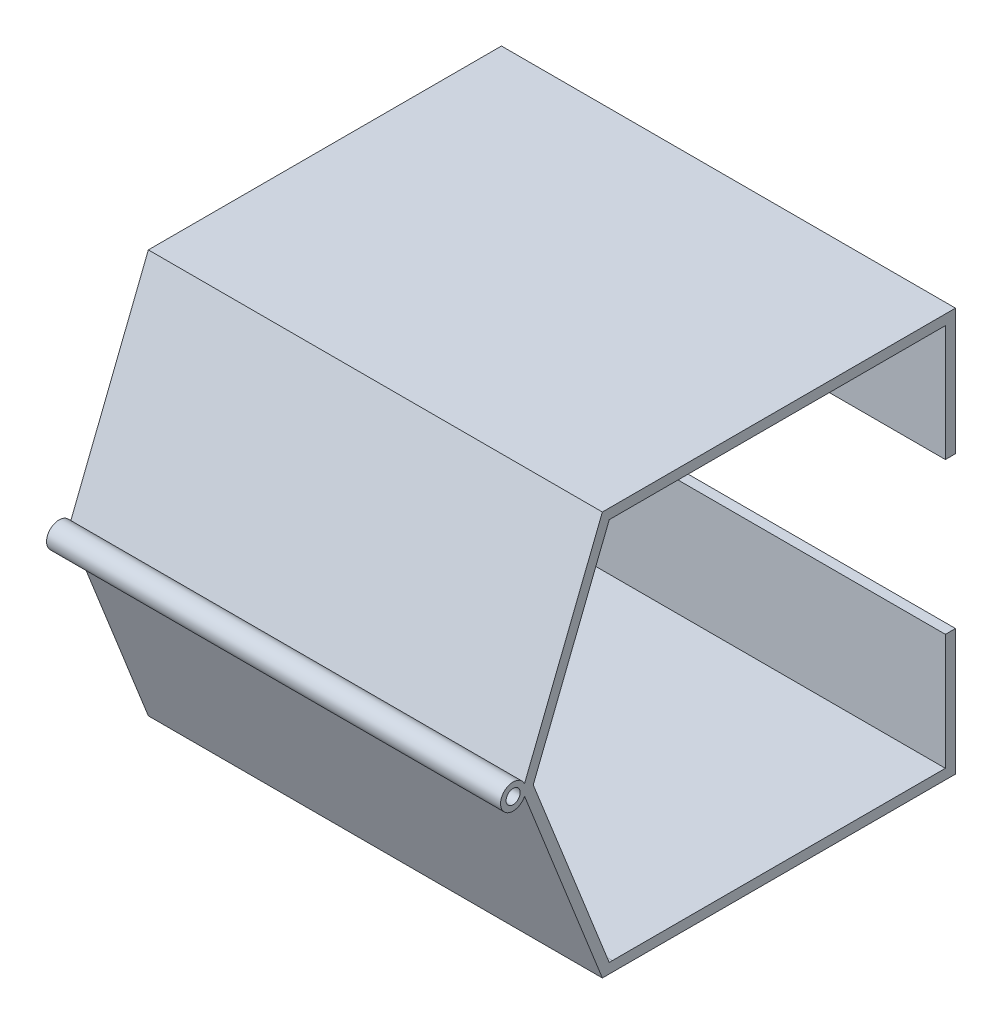
ISO-10303-21;
HEADER;
FILE_DESCRIPTION(('STEP AP214'),'2;1');
FILE_NAME('part.step','',(''),(''),'','','');
FILE_SCHEMA(('AUTOMOTIVE_DESIGN { 1 0 10303 214 1 1 1 1 }'));
ENDSEC;
DATA;
#1=APPLICATION_CONTEXT('core data for automotive mechanical design processes');
#2=APPLICATION_PROTOCOL_DEFINITION('international standard','automotive_design',2000,#1);
#3=PRODUCT_CONTEXT('',#1,'mechanical');
#4=PRODUCT('Part','Part','',(#3));
#5=PRODUCT_RELATED_PRODUCT_CATEGORY('part','',(#4));
#6=PRODUCT_DEFINITION_FORMATION('','',#4);
#7=PRODUCT_DEFINITION_CONTEXT('part definition',#1,'design');
#8=PRODUCT_DEFINITION('design','',#6,#7);
#9=PRODUCT_DEFINITION_SHAPE('','',#8);
#10=(LENGTH_UNIT() NAMED_UNIT(*) SI_UNIT(.MILLI.,.METRE.));
#11=(NAMED_UNIT(*) PLANE_ANGLE_UNIT() SI_UNIT($,.RADIAN.));
#12=(NAMED_UNIT(*) SI_UNIT($,.STERADIAN.) SOLID_ANGLE_UNIT());
#13=UNCERTAINTY_MEASURE_WITH_UNIT(LENGTH_MEASURE(1.E-05),#10,'distance_accuracy_value','');
#14=(GEOMETRIC_REPRESENTATION_CONTEXT(3) GLOBAL_UNCERTAINTY_ASSIGNED_CONTEXT((#13)) GLOBAL_UNIT_ASSIGNED_CONTEXT((#10,
#11,#12)) REPRESENTATION_CONTEXT('',''));
#15=CARTESIAN_POINT('',(0.,0.,0.));
#16=DIRECTION('',(0.,0.,1.));
#17=DIRECTION('',(1.,0.,0.));
#18=AXIS2_PLACEMENT_3D('',#15,#16,#17);
#19=CARTESIAN_POINT('',(0.,0.,0.));
#20=DIRECTION('',(0.,0.,1.));
#21=DIRECTION('',(1.,0.,0.));
#22=AXIS2_PLACEMENT_3D('',#19,#20,#21);
#23=PLANE('',#22);
#24=DIRECTION('',(0.,-1.,0.));
#25=VECTOR('',#24,1.);
#26=CARTESIAN_POINT('',(-45.,40.,0.));
#27=LINE('',#26,#25);
#28=CARTESIAN_POINT('',(-45.,-15.,0.));
#29=VERTEX_POINT('',#28);
#30=CARTESIAN_POINT('',(-45.,-40.,0.));
#31=VERTEX_POINT('',#30);
#32=EDGE_CURVE('E163',#29,#31,#27,.T.);
#33=ORIENTED_EDGE('',*,*,#32,.F.);
#34=DIRECTION('',(-1.,0.,0.));
#35=VECTOR('',#34,1.);
#36=CARTESIAN_POINT('',(-45.,-15.,0.));
#37=LINE('',#36,#35);
#38=CARTESIAN_POINT('',(45.,-15.,0.));
#39=VERTEX_POINT('',#38);
#40=EDGE_CURVE('E150',#39,#29,#37,.T.);
#41=ORIENTED_EDGE('',*,*,#40,.F.);
#42=DIRECTION('',(0.,-1.,0.));
#43=VECTOR('',#42,1.);
#44=CARTESIAN_POINT('',(45.,40.,0.));
#45=LINE('',#44,#43);
#46=CARTESIAN_POINT('',(45.,-40.,0.));
#47=VERTEX_POINT('',#46);
#48=EDGE_CURVE('E183',#39,#47,#45,.T.);
#49=ORIENTED_EDGE('',*,*,#48,.T.);
#50=DIRECTION('',(1.,0.,0.));
#51=VECTOR('',#50,1.);
#52=CARTESIAN_POINT('',(-45.,-40.,0.));
#53=LINE('',#52,#51);
#54=EDGE_CURVE('E170',#31,#47,#53,.T.);
#55=ORIENTED_EDGE('',*,*,#54,.F.);
#56=EDGE_LOOP('',(#33,#41,#49,#55));
#57=FACE_BOUND('',#56,.T.);
#58=ADVANCED_FACE('F34',(#57),#23,.F.);
#59=CARTESIAN_POINT('',(45.0000000000001,38.,2.));
#60=DIRECTION('',(0.,0.,-1.));
#61=DIRECTION('',(0.,1.,0.));
#62=AXIS2_PLACEMENT_3D('',#59,#60,#61);
#63=PLANE('',#62);
#64=DIRECTION('',(0.,-1.,0.));
#65=VECTOR('',#64,1.);
#66=CARTESIAN_POINT('',(45.0000000000001,38.,2.));
#67=LINE('',#66,#65);
#68=CARTESIAN_POINT('',(45.,-15.,2.00000000000001));
#69=VERTEX_POINT('',#68);
#70=CARTESIAN_POINT('',(45.0000000000001,-38.,2.00000000000001));
#71=VERTEX_POINT('',#70);
#72=EDGE_CURVE('E220',#69,#71,#67,.T.);
#73=ORIENTED_EDGE('',*,*,#72,.F.);
#74=DIRECTION('',(-1.,0.,0.));
#75=VECTOR('',#74,1.);
#76=CARTESIAN_POINT('',(45.0000000000001,-15.,2.00000000000001));
#77=LINE('',#76,#75);
#78=CARTESIAN_POINT('',(-45.,-15.,2.00000000000001));
#79=VERTEX_POINT('',#78);
#80=EDGE_CURVE('E11',#69,#79,#77,.T.);
#81=ORIENTED_EDGE('',*,*,#80,.T.);
#82=DIRECTION('',(0.,-1.,0.));
#83=VECTOR('',#82,1.);
#84=CARTESIAN_POINT('',(-45.,38.,2.));
#85=LINE('',#84,#83);
#86=CARTESIAN_POINT('',(-45.,-38.,2.00000000000001));
#87=VERTEX_POINT('',#86);
#88=EDGE_CURVE('E166',#79,#87,#85,.T.);
#89=ORIENTED_EDGE('',*,*,#88,.T.);
#90=DIRECTION('',(-1.,0.,0.));
#91=VECTOR('',#90,1.);
#92=CARTESIAN_POINT('',(45.0000000000001,-38.,2.00000000000001));
#93=LINE('',#92,#91);
#94=EDGE_CURVE('E239',#71,#87,#93,.T.);
#95=ORIENTED_EDGE('',*,*,#94,.F.);
#96=EDGE_LOOP('',(#73,#81,#89,#95));
#97=FACE_BOUND('',#96,.T.);
#98=ADVANCED_FACE('F342',(#97),#63,.F.);
#99=CARTESIAN_POINT('',(-45.,40.,70.));
#100=DIRECTION('',(1.,0.,0.));
#101=DIRECTION('',(0.,1.,0.));
#102=AXIS2_PLACEMENT_3D('',#99,#100,#101);
#103=PLANE('',#102);
#104=ORIENTED_EDGE('',*,*,#88,.F.);
#105=DIRECTION('',(0.,0.,-1.));
#106=VECTOR('',#105,1.);
#107=CARTESIAN_POINT('',(-45.,-15.,10.));
#108=LINE('',#107,#106);
#109=EDGE_CURVE('E57',#79,#29,#108,.T.);
#110=ORIENTED_EDGE('',*,*,#109,.T.);
#111=ORIENTED_EDGE('',*,*,#32,.T.);
#112=DIRECTION('',(0.,0.,-1.));
#113=VECTOR('',#112,1.);
#114=CARTESIAN_POINT('',(-45.,-40.,70.));
#115=LINE('',#114,#113);
#116=CARTESIAN_POINT('',(-45.,-40.,70.));
#117=VERTEX_POINT('',#116);
#118=EDGE_CURVE('E198',#117,#31,#115,.T.);
#119=ORIENTED_EDGE('',*,*,#118,.F.);
#120=DIRECTION('',(0.,-0.929654098940421,-0.368433516829391));
#121=VECTOR('',#120,1.);
#122=CARTESIAN_POINT('',(-45.,0.,85.8524989993296));
#123=LINE('',#122,#121);
#124=CARTESIAN_POINT('',(-45.,-1.07289757690252,85.4272963052238));
#125=VERTEX_POINT('',#124);
#126=EDGE_CURVE('E261',#125,#117,#123,.T.);
#127=ORIENTED_EDGE('',*,*,#126,.F.);
#128=CARTESIAN_POINT('',(-45.,0.,87.6853686666588));
#129=DIRECTION('',(-1.,0.,0.));
#130=DIRECTION('',(0.,-1.,0.));
#131=AXIS2_PLACEMENT_3D('',#128,#129,#130);
#132=CIRCLE('',#131,2.5);
#133=CARTESIAN_POINT('',(-45.,1.07289757690249,85.4272963052238));
#134=VERTEX_POINT('',#133);
#135=EDGE_CURVE('E249',#125,#134,#132,.T.);
#136=ORIENTED_EDGE('',*,*,#135,.T.);
#137=DIRECTION('',(0.,-0.929654098940421,0.368433516829391));
#138=VECTOR('',#137,1.);
#139=CARTESIAN_POINT('',(-45.,40.,70.));
#140=LINE('',#139,#138);
#141=CARTESIAN_POINT('',(-45.,40.,70.));
#142=VERTEX_POINT('',#141);
#143=EDGE_CURVE('E259',#142,#134,#140,.T.);
#144=ORIENTED_EDGE('',*,*,#143,.F.);
#145=DIRECTION('',(0.,0.,-1.));
#146=VECTOR('',#145,1.);
#147=CARTESIAN_POINT('',(-45.,40.,70.));
#148=LINE('',#147,#146);
#149=CARTESIAN_POINT('',(-45.,40.,0.));
#150=VERTEX_POINT('',#149);
#151=EDGE_CURVE('E191',#142,#150,#148,.T.);
#152=ORIENTED_EDGE('',*,*,#151,.T.);
#153=CARTESIAN_POINT('',(-45.,15.,0.));
#154=VERTEX_POINT('',#153);
#155=EDGE_CURVE('E172',#150,#154,#27,.T.);
#156=ORIENTED_EDGE('',*,*,#155,.T.);
#157=DIRECTION('',(0.,0.,-1.));
#158=VECTOR('',#157,1.);
#159=CARTESIAN_POINT('',(-45.,15.,10.));
#160=LINE('',#159,#158);
#161=CARTESIAN_POINT('',(-45.,15.,2.00000000000001));
#162=VERTEX_POINT('',#161);
#163=EDGE_CURVE('E167',#162,#154,#160,.T.);
#164=ORIENTED_EDGE('',*,*,#163,.F.);
#165=CARTESIAN_POINT('',(-45.,38.,2.));
#166=VERTEX_POINT('',#165);
#167=EDGE_CURVE('E209',#166,#162,#85,.T.);
#168=ORIENTED_EDGE('',*,*,#167,.F.);
#169=DIRECTION('',(0.,0.,-1.));
#170=VECTOR('',#169,1.);
#171=CARTESIAN_POINT('',(-45.,38.,2.));
#172=LINE('',#171,#170);
#173=CARTESIAN_POINT('',(-45.,38.,68.));
#174=VERTEX_POINT('',#173);
#175=EDGE_CURVE('E228',#174,#166,#172,.T.);
#176=ORIENTED_EDGE('',*,*,#175,.F.);
#177=DIRECTION('',(0.,0.000466444161132353,0.999999891214916));
#178=VECTOR('',#177,1.);
#179=CARTESIAN_POINT('',(-45.,38.000299069396,68.6411686293103));
#180=LINE('',#179,#178);
#181=CARTESIAN_POINT('',(-45.,38.000299069396,68.6411686293103));
#182=VERTEX_POINT('',#181);
#183=EDGE_CURVE('E292',#174,#182,#180,.T.);
#184=ORIENTED_EDGE('',*,*,#183,.T.);
#185=DIRECTION('',(0.,-0.929654098940421,0.368433516829391));
#186=VECTOR('',#185,1.);
#187=CARTESIAN_POINT('',(-45.,38.000299069396,68.6411686293103));
#188=LINE('',#187,#186);
#189=CARTESIAN_POINT('',(-45.,0.,83.7011612036058));
#190=VERTEX_POINT('',#189);
#191=EDGE_CURVE('E295',#182,#190,#188,.T.);
#192=ORIENTED_EDGE('',*,*,#191,.T.);
#193=DIRECTION('',(0.,-0.929654098940421,-0.368433516829391));
#194=VECTOR('',#193,1.);
#195=CARTESIAN_POINT('',(-45.,0.,83.7011612036058));
#196=LINE('',#195,#194);
#197=CARTESIAN_POINT('',(-45.,-38.0022031989218,68.6404139990252));
#198=VERTEX_POINT('',#197);
#199=EDGE_CURVE('E299',#190,#198,#196,.T.);
#200=ORIENTED_EDGE('',*,*,#199,.T.);
#201=DIRECTION('',(0.,0.00344025253563664,-0.999994082313736));
#202=VECTOR('',#201,1.);
#203=CARTESIAN_POINT('',(-45.,-38.0022031989218,68.6404139990252));
#204=LINE('',#203,#202);
#205=CARTESIAN_POINT('',(-45.,-38.,68.));
#206=VERTEX_POINT('',#205);
#207=EDGE_CURVE('E302',#198,#206,#204,.T.);
#208=ORIENTED_EDGE('',*,*,#207,.T.);
#209=DIRECTION('',(0.,0.,1.));
#210=VECTOR('',#209,1.);
#211=CARTESIAN_POINT('',(-45.,-38.,2.00000000000001));
#212=LINE('',#211,#210);
#213=EDGE_CURVE('E233',#87,#206,#212,.T.);
#214=ORIENTED_EDGE('',*,*,#213,.F.);
#215=EDGE_LOOP('',(#104,#110,#111,#119,#127,#136,#144,#152,#156,#164,#168,#176,#184,#192,#200,
#208,#214));
#216=FACE_BOUND('',#215,.T.);
#217=CARTESIAN_POINT('',(-45.,0.,87.6853686666588));
#218=DIRECTION('',(-1.,0.,0.));
#219=DIRECTION('',(0.,-1.,0.));
#220=AXIS2_PLACEMENT_3D('',#217,#218,#219);
#221=CIRCLE('',#220,1.4);
#222=CARTESIAN_POINT('',(-45.,-1.40000000000001,87.6853686666588));
#223=VERTEX_POINT('',#222);
#224=EDGE_CURVE('E238',#223,#223,#221,.T.);
#225=ORIENTED_EDGE('',*,*,#224,.F.);
#226=EDGE_LOOP('',(#225));
#227=FACE_BOUND('',#226,.T.);
#228=ADVANCED_FACE('F36',(#216,#227),#103,.F.);
#229=CARTESIAN_POINT('',(-45.,-40.,70.));
#230=DIRECTION('',(0.,1.,0.));
#231=DIRECTION('',(0.,0.,1.));
#232=AXIS2_PLACEMENT_3D('',#229,#230,#231);
#233=PLANE('',#232);
#234=ORIENTED_EDGE('',*,*,#54,.T.);
#235=DIRECTION('',(0.,0.,-1.));
#236=VECTOR('',#235,1.);
#237=CARTESIAN_POINT('',(45.,-40.,70.));
#238=LINE('',#237,#236);
#239=CARTESIAN_POINT('',(45.,-40.,70.));
#240=VERTEX_POINT('',#239);
#241=EDGE_CURVE('E195',#240,#47,#238,.T.);
#242=ORIENTED_EDGE('',*,*,#241,.F.);
#243=DIRECTION('',(1.,0.,0.));
#244=VECTOR('',#243,1.);
#245=CARTESIAN_POINT('',(-45.,-40.,70.));
#246=LINE('',#245,#244);
#247=EDGE_CURVE('E190',#117,#240,#246,.T.);
#248=ORIENTED_EDGE('',*,*,#247,.F.);
#249=ORIENTED_EDGE('',*,*,#118,.T.);
#250=EDGE_LOOP('',(#234,#242,#248,#249));
#251=FACE_BOUND('',#250,.T.);
#252=ADVANCED_FACE('F361',(#251),#233,.F.);
#253=CARTESIAN_POINT('',(45.,40.,70.));
#254=DIRECTION('',(1.,0.,0.));
#255=DIRECTION('',(0.,1.,0.));
#256=AXIS2_PLACEMENT_3D('',#253,#254,#255);
#257=PLANE('',#256);
#258=DIRECTION('',(0.,0.,-1.));
#259=VECTOR('',#258,1.);
#260=CARTESIAN_POINT('',(45.,-15.,10.));
#261=LINE('',#260,#259);
#262=EDGE_CURVE('E153',#69,#39,#261,.T.);
#263=ORIENTED_EDGE('',*,*,#262,.F.);
#264=ORIENTED_EDGE('',*,*,#72,.T.);
#265=DIRECTION('',(0.,0.,1.));
#266=VECTOR('',#265,1.);
#267=CARTESIAN_POINT('',(45.0000000000001,-38.,2.00000000000001));
#268=LINE('',#267,#266);
#269=CARTESIAN_POINT('',(45.,-38.,68.));
#270=VERTEX_POINT('',#269);
#271=EDGE_CURVE('E219',#71,#270,#268,.T.);
#272=ORIENTED_EDGE('',*,*,#271,.T.);
#273=DIRECTION('',(0.,0.00344025253563664,-0.999994082313736));
#274=VECTOR('',#273,1.);
#275=CARTESIAN_POINT('',(45.,-38.0022031989218,68.6404139990252));
#276=LINE('',#275,#274);
#277=CARTESIAN_POINT('',(45.,-38.0022031989218,68.6404139990252));
#278=VERTEX_POINT('',#277);
#279=EDGE_CURVE('E296',#278,#270,#276,.T.);
#280=ORIENTED_EDGE('',*,*,#279,.F.);
#281=DIRECTION('',(0.,-0.929654098940421,-0.368433516829391));
#282=VECTOR('',#281,1.);
#283=CARTESIAN_POINT('',(45.,0.,83.7011612036058));
#284=LINE('',#283,#282);
#285=CARTESIAN_POINT('',(45.,0.,83.7011612036058));
#286=VERTEX_POINT('',#285);
#287=EDGE_CURVE('E312',#286,#278,#284,.T.);
#288=ORIENTED_EDGE('',*,*,#287,.F.);
#289=DIRECTION('',(0.,-0.929654098940421,0.368433516829391));
#290=VECTOR('',#289,1.);
#291=CARTESIAN_POINT('',(45.,38.000299069396,68.6411686293103));
#292=LINE('',#291,#290);
#293=CARTESIAN_POINT('',(45.,38.000299069396,68.6411686293103));
#294=VERTEX_POINT('',#293);
#295=EDGE_CURVE('E309',#294,#286,#292,.T.);
#296=ORIENTED_EDGE('',*,*,#295,.F.);
#297=DIRECTION('',(0.,0.000466444161132353,0.999999891214916));
#298=VECTOR('',#297,1.);
#299=CARTESIAN_POINT('',(45.,38.000299069396,68.6411686293103));
#300=LINE('',#299,#298);
#301=CARTESIAN_POINT('',(45.,38.,68.));
#302=VERTEX_POINT('',#301);
#303=EDGE_CURVE('E306',#302,#294,#300,.T.);
#304=ORIENTED_EDGE('',*,*,#303,.F.);
#305=DIRECTION('',(0.,0.,-1.));
#306=VECTOR('',#305,1.);
#307=CARTESIAN_POINT('',(45.0000000000001,38.,2.));
#308=LINE('',#307,#306);
#309=CARTESIAN_POINT('',(45.,38.,2.));
#310=VERTEX_POINT('',#309);
#311=EDGE_CURVE('E218',#302,#310,#308,.T.);
#312=ORIENTED_EDGE('',*,*,#311,.T.);
#313=CARTESIAN_POINT('',(45.0000000000001,15.,2.));
#314=VERTEX_POINT('',#313);
#315=EDGE_CURVE('E206',#310,#314,#67,.T.);
#316=ORIENTED_EDGE('',*,*,#315,.T.);
#317=DIRECTION('',(0.,0.,-1.));
#318=VECTOR('',#317,1.);
#319=CARTESIAN_POINT('',(45.,15.,10.));
#320=LINE('',#319,#318);
#321=CARTESIAN_POINT('',(45.,15.,0.));
#322=VERTEX_POINT('',#321);
#323=EDGE_CURVE('E49',#314,#322,#320,.T.);
#324=ORIENTED_EDGE('',*,*,#323,.T.);
#325=CARTESIAN_POINT('',(45.,40.,0.));
#326=VERTEX_POINT('',#325);
#327=EDGE_CURVE('E184',#326,#322,#45,.T.);
#328=ORIENTED_EDGE('',*,*,#327,.F.);
#329=DIRECTION('',(0.,0.,-1.));
#330=VECTOR('',#329,1.);
#331=CARTESIAN_POINT('',(45.,40.,70.));
#332=LINE('',#331,#330);
#333=CARTESIAN_POINT('',(45.,40.,70.));
#334=VERTEX_POINT('',#333);
#335=EDGE_CURVE('E193',#334,#326,#332,.T.);
#336=ORIENTED_EDGE('',*,*,#335,.F.);
#337=DIRECTION('',(0.,-0.929654098940421,0.368433516829391));
#338=VECTOR('',#337,1.);
#339=CARTESIAN_POINT('',(45.,40.,70.));
#340=LINE('',#339,#338);
#341=CARTESIAN_POINT('',(45.,1.0728975769025,85.4272963052238));
#342=VERTEX_POINT('',#341);
#343=EDGE_CURVE('E176',#334,#342,#340,.T.);
#344=ORIENTED_EDGE('',*,*,#343,.T.);
#345=CARTESIAN_POINT('',(45.,0.,87.6853686666588));
#346=DIRECTION('',(-1.,0.,0.));
#347=DIRECTION('',(0.,-1.,0.));
#348=AXIS2_PLACEMENT_3D('',#345,#346,#347);
#349=CIRCLE('',#348,2.5);
#350=CARTESIAN_POINT('',(45.,-1.0728975769025,85.4272963052238));
#351=VERTEX_POINT('',#350);
#352=EDGE_CURVE('E252',#351,#342,#349,.T.);
#353=ORIENTED_EDGE('',*,*,#352,.F.);
#354=DIRECTION('',(0.,-0.929654098940421,-0.368433516829391));
#355=VECTOR('',#354,1.);
#356=CARTESIAN_POINT('',(45.,0.,85.8524989993296));
#357=LINE('',#356,#355);
#358=EDGE_CURVE('E173',#351,#240,#357,.T.);
#359=ORIENTED_EDGE('',*,*,#358,.T.);
#360=ORIENTED_EDGE('',*,*,#241,.T.);
#361=ORIENTED_EDGE('',*,*,#48,.F.);
#362=EDGE_LOOP('',(#263,#264,#272,#280,#288,#296,#304,#312,#316,#324,#328,#336,#344,#353,#359,
#360,#361));
#363=FACE_BOUND('',#362,.T.);
#364=CARTESIAN_POINT('',(45.,0.,87.6853686666588));
#365=DIRECTION('',(-1.,0.,0.));
#366=DIRECTION('',(0.,-1.,0.));
#367=AXIS2_PLACEMENT_3D('',#364,#365,#366);
#368=CIRCLE('',#367,1.4);
#369=CARTESIAN_POINT('',(45.,-1.39999999999999,87.6853686666588));
#370=VERTEX_POINT('',#369);
#371=EDGE_CURVE('E246',#370,#370,#368,.T.);
#372=ORIENTED_EDGE('',*,*,#371,.T.);
#373=EDGE_LOOP('',(#372));
#374=FACE_BOUND('',#373,.T.);
#375=ADVANCED_FACE('F213',(#363,#374),#257,.T.);
#376=CARTESIAN_POINT('',(-45.,40.,70.));
#377=DIRECTION('',(0.,1.,0.));
#378=DIRECTION('',(0.,0.,1.));
#379=AXIS2_PLACEMENT_3D('',#376,#377,#378);
#380=PLANE('',#379);
#381=DIRECTION('',(1.,0.,0.));
#382=VECTOR('',#381,1.);
#383=CARTESIAN_POINT('',(-45.,40.,0.));
#384=LINE('',#383,#382);
#385=EDGE_CURVE('E187',#150,#326,#384,.T.);
#386=ORIENTED_EDGE('',*,*,#385,.F.);
#387=ORIENTED_EDGE('',*,*,#151,.F.);
#388=DIRECTION('',(1.,0.,0.));
#389=VECTOR('',#388,1.);
#390=CARTESIAN_POINT('',(-45.,40.,70.));
#391=LINE('',#390,#389);
#392=EDGE_CURVE('E180',#142,#334,#391,.T.);
#393=ORIENTED_EDGE('',*,*,#392,.T.);
#394=ORIENTED_EDGE('',*,*,#335,.T.);
#395=EDGE_LOOP('',(#386,#387,#393,#394));
#396=FACE_BOUND('',#395,.T.);
#397=ADVANCED_FACE('F272',(#396),#380,.T.);
#398=ORIENTED_EDGE('',*,*,#327,.T.);
#399=DIRECTION('',(1.,0.,0.));
#400=VECTOR('',#399,1.);
#401=CARTESIAN_POINT('',(45.,15.,0.));
#402=LINE('',#401,#400);
#403=EDGE_CURVE('E157',#154,#322,#402,.T.);
#404=ORIENTED_EDGE('',*,*,#403,.F.);
#405=ORIENTED_EDGE('',*,*,#155,.F.);
#406=ORIENTED_EDGE('',*,*,#385,.T.);
#407=EDGE_LOOP('',(#398,#404,#405,#406));
#408=FACE_BOUND('',#407,.T.);
#409=ADVANCED_FACE('F286',(#408),#23,.F.);
#410=CARTESIAN_POINT('',(45.,40.,70.));
#411=DIRECTION('',(0.,-0.368433516829391,-0.929654098940421));
#412=DIRECTION('',(0.,0.929654098940421,-0.368433516829391));
#413=AXIS2_PLACEMENT_3D('',#410,#411,#412);
#414=PLANE('',#413);
#415=ORIENTED_EDGE('',*,*,#143,.T.);
#416=DIRECTION('',(-1.,0.,0.));
#417=VECTOR('',#416,1.);
#418=CARTESIAN_POINT('',(45.,1.0728975769025,85.4272963052238));
#419=LINE('',#418,#417);
#420=EDGE_CURVE('E255',#134,#342,#419,.F.);
#421=ORIENTED_EDGE('',*,*,#420,.T.);
#422=ORIENTED_EDGE('',*,*,#343,.F.);
#423=ORIENTED_EDGE('',*,*,#392,.F.);
#424=EDGE_LOOP('',(#415,#421,#422,#423));
#425=FACE_BOUND('',#424,.T.);
#426=ADVANCED_FACE('F276',(#425),#414,.F.);
#427=CARTESIAN_POINT('',(45.,0.,85.8524989993296));
#428=DIRECTION('',(0.,0.368433516829391,-0.929654098940421));
#429=DIRECTION('',(0.,0.929654098940421,0.368433516829391));
#430=AXIS2_PLACEMENT_3D('',#427,#428,#429);
#431=PLANE('',#430);
#432=ORIENTED_EDGE('',*,*,#358,.F.);
#433=DIRECTION('',(-1.,0.,0.));
#434=VECTOR('',#433,1.);
#435=CARTESIAN_POINT('',(45.,-1.07289757690251,85.4272963052238));
#436=LINE('',#435,#434);
#437=EDGE_CURVE('E200',#351,#125,#436,.T.);
#438=ORIENTED_EDGE('',*,*,#437,.T.);
#439=ORIENTED_EDGE('',*,*,#126,.T.);
#440=ORIENTED_EDGE('',*,*,#247,.T.);
#441=EDGE_LOOP('',(#432,#438,#439,#440));
#442=FACE_BOUND('',#441,.T.);
#443=ADVANCED_FACE('F357',(#442),#431,.F.);
#444=CARTESIAN_POINT('',(45.,0.,87.6853686666588));
#445=DIRECTION('',(-1.,0.,0.));
#446=DIRECTION('',(0.,-1.,0.));
#447=AXIS2_PLACEMENT_3D('',#444,#445,#446);
#448=CYLINDRICAL_SURFACE('',#447,2.5);
#449=ORIENTED_EDGE('',*,*,#420,.F.);
#450=ORIENTED_EDGE('',*,*,#135,.F.);
#451=ORIENTED_EDGE('',*,*,#437,.F.);
#452=ORIENTED_EDGE('',*,*,#352,.T.);
#453=EDGE_LOOP('',(#449,#450,#451,#452));
#454=FACE_BOUND('',#453,.T.);
#455=ADVANCED_FACE('F282',(#454),#448,.T.);
#456=CARTESIAN_POINT('',(45.,0.,87.6853686666588));
#457=DIRECTION('',(-1.,0.,0.));
#458=DIRECTION('',(0.,-1.,0.));
#459=AXIS2_PLACEMENT_3D('',#456,#457,#458);
#460=CYLINDRICAL_SURFACE('',#459,1.4);
#461=ORIENTED_EDGE('',*,*,#371,.F.);
#462=EDGE_LOOP('',(#461));
#463=FACE_BOUND('',#462,.T.);
#464=ORIENTED_EDGE('',*,*,#224,.T.);
#465=EDGE_LOOP('',(#464));
#466=FACE_BOUND('',#465,.T.);
#467=ADVANCED_FACE('F373',(#463,#466),#460,.F.);
#468=CARTESIAN_POINT('',(45.0000000000001,-38.,2.00000000000001));
#469=DIRECTION('',(0.,-1.,0.));
#470=DIRECTION('',(0.,0.,-1.));
#471=AXIS2_PLACEMENT_3D('',#468,#469,#470);
#472=PLANE('',#471);
#473=ORIENTED_EDGE('',*,*,#213,.T.);
#474=DIRECTION('',(-1.,0.,0.));
#475=VECTOR('',#474,1.);
#476=CARTESIAN_POINT('',(45.0000000000001,-38.,68.));
#477=LINE('',#476,#475);
#478=EDGE_CURVE('E236',#270,#206,#477,.T.);
#479=ORIENTED_EDGE('',*,*,#478,.F.);
#480=ORIENTED_EDGE('',*,*,#271,.F.);
#481=ORIENTED_EDGE('',*,*,#94,.T.);
#482=EDGE_LOOP('',(#473,#479,#480,#481));
#483=FACE_BOUND('',#482,.T.);
#484=ADVANCED_FACE('F340',(#483),#472,.F.);
#485=ORIENTED_EDGE('',*,*,#167,.T.);
#486=DIRECTION('',(1.,0.,0.));
#487=VECTOR('',#486,1.);
#488=CARTESIAN_POINT('',(45.0000000000001,15.,2.));
#489=LINE('',#488,#487);
#490=EDGE_CURVE('E42',#162,#314,#489,.T.);
#491=ORIENTED_EDGE('',*,*,#490,.T.);
#492=ORIENTED_EDGE('',*,*,#315,.F.);
#493=DIRECTION('',(-1.,0.,0.));
#494=VECTOR('',#493,1.);
#495=CARTESIAN_POINT('',(45.0000000000001,38.,2.));
#496=LINE('',#495,#494);
#497=EDGE_CURVE('E242',#310,#166,#496,.T.);
#498=ORIENTED_EDGE('',*,*,#497,.T.);
#499=EDGE_LOOP('',(#485,#491,#492,#498));
#500=FACE_BOUND('',#499,.T.);
#501=ADVANCED_FACE('F205',(#500),#63,.F.);
#502=CARTESIAN_POINT('',(45.0000000000001,38.,2.));
#503=DIRECTION('',(0.,1.,0.));
#504=DIRECTION('',(0.,0.,1.));
#505=AXIS2_PLACEMENT_3D('',#502,#503,#504);
#506=PLANE('',#505);
#507=ORIENTED_EDGE('',*,*,#175,.T.);
#508=ORIENTED_EDGE('',*,*,#497,.F.);
#509=ORIENTED_EDGE('',*,*,#311,.F.);
#510=DIRECTION('',(-1.,0.,0.));
#511=VECTOR('',#510,1.);
#512=CARTESIAN_POINT('',(45.0000000000001,38.,68.));
#513=LINE('',#512,#511);
#514=EDGE_CURVE('E223',#302,#174,#513,.T.);
#515=ORIENTED_EDGE('',*,*,#514,.T.);
#516=EDGE_LOOP('',(#507,#508,#509,#515));
#517=FACE_BOUND('',#516,.T.);
#518=ADVANCED_FACE('F331',(#517),#506,.F.);
#519=CARTESIAN_POINT('',(-45.,38.000299069396,68.6411686293103));
#520=DIRECTION('',(0.,0.999999891214916,-0.000466444161132353));
#521=DIRECTION('',(0.,0.000466444161132353,0.999999891214916));
#522=AXIS2_PLACEMENT_3D('',#519,#520,#521);
#523=PLANE('',#522);
#524=ORIENTED_EDGE('',*,*,#303,.T.);
#525=DIRECTION('',(1.,0.,0.));
#526=VECTOR('',#525,1.);
#527=CARTESIAN_POINT('',(-45.,38.000299069396,68.6411686293103));
#528=LINE('',#527,#526);
#529=EDGE_CURVE('E305',#182,#294,#528,.T.);
#530=ORIENTED_EDGE('',*,*,#529,.F.);
#531=ORIENTED_EDGE('',*,*,#183,.F.);
#532=ORIENTED_EDGE('',*,*,#514,.F.);
#533=EDGE_LOOP('',(#524,#530,#531,#532));
#534=FACE_BOUND('',#533,.T.);
#535=ADVANCED_FACE('F324',(#534),#523,.F.);
#536=CARTESIAN_POINT('',(-45.,-38.0022031989218,68.6404139990252));
#537=DIRECTION('',(0.,-0.999994082313736,-0.00344025253563664));
#538=DIRECTION('',(0.,0.00344025253563664,-0.999994082313736));
#539=AXIS2_PLACEMENT_3D('',#536,#537,#538);
#540=PLANE('',#539);
#541=ORIENTED_EDGE('',*,*,#279,.T.);
#542=ORIENTED_EDGE('',*,*,#478,.T.);
#543=ORIENTED_EDGE('',*,*,#207,.F.);
#544=DIRECTION('',(1.,0.,0.));
#545=VECTOR('',#544,1.);
#546=CARTESIAN_POINT('',(-45.,-38.0022031989218,68.6404139990252));
#547=LINE('',#546,#545);
#548=EDGE_CURVE('E231',#198,#278,#547,.T.);
#549=ORIENTED_EDGE('',*,*,#548,.T.);
#550=EDGE_LOOP('',(#541,#542,#543,#549));
#551=FACE_BOUND('',#550,.T.);
#552=ADVANCED_FACE('F338',(#551),#540,.F.);
#553=CARTESIAN_POINT('',(-45.,0.,83.7011612036058));
#554=DIRECTION('',(0.,-0.368433516829391,0.929654098940421));
#555=DIRECTION('',(0.,-0.929654098940421,-0.368433516829391));
#556=AXIS2_PLACEMENT_3D('',#553,#554,#555);
#557=PLANE('',#556);
#558=ORIENTED_EDGE('',*,*,#287,.T.);
#559=ORIENTED_EDGE('',*,*,#548,.F.);
#560=ORIENTED_EDGE('',*,*,#199,.F.);
#561=DIRECTION('',(1.,0.,0.));
#562=VECTOR('',#561,1.);
#563=CARTESIAN_POINT('',(-45.,0.,83.7011612036058));
#564=LINE('',#563,#562);
#565=EDGE_CURVE('E317',#190,#286,#564,.T.);
#566=ORIENTED_EDGE('',*,*,#565,.T.);
#567=EDGE_LOOP('',(#558,#559,#560,#566));
#568=FACE_BOUND('',#567,.T.);
#569=ADVANCED_FACE('F327',(#568),#557,.F.);
#570=CARTESIAN_POINT('',(-45.,38.000299069396,68.6411686293103));
#571=DIRECTION('',(0.,0.368433516829391,0.929654098940421));
#572=DIRECTION('',(0.,-0.929654098940421,0.368433516829391));
#573=AXIS2_PLACEMENT_3D('',#570,#571,#572);
#574=PLANE('',#573);
#575=ORIENTED_EDGE('',*,*,#295,.T.);
#576=ORIENTED_EDGE('',*,*,#565,.F.);
#577=ORIENTED_EDGE('',*,*,#191,.F.);
#578=ORIENTED_EDGE('',*,*,#529,.T.);
#579=EDGE_LOOP('',(#575,#576,#577,#578));
#580=FACE_BOUND('',#579,.T.);
#581=ADVANCED_FACE('F320',(#580),#574,.F.);
#582=CARTESIAN_POINT('',(45.,15.,10.));
#583=DIRECTION('',(0.,1.,0.));
#584=DIRECTION('',(0.,0.,1.));
#585=AXIS2_PLACEMENT_3D('',#582,#583,#584);
#586=PLANE('',#585);
#587=ORIENTED_EDGE('',*,*,#163,.T.);
#588=ORIENTED_EDGE('',*,*,#403,.T.);
#589=ORIENTED_EDGE('',*,*,#323,.F.);
#590=ORIENTED_EDGE('',*,*,#490,.F.);
#591=EDGE_LOOP('',(#587,#588,#589,#590));
#592=FACE_BOUND('',#591,.T.);
#593=ADVANCED_FACE('F390',(#592),#586,.F.);
#594=CARTESIAN_POINT('',(-45.,-15.,10.));
#595=DIRECTION('',(0.,-1.,0.));
#596=DIRECTION('',(1.,0.,0.));
#597=AXIS2_PLACEMENT_3D('',#594,#595,#596);
#598=PLANE('',#597);
#599=ORIENTED_EDGE('',*,*,#262,.T.);
#600=ORIENTED_EDGE('',*,*,#40,.T.);
#601=ORIENTED_EDGE('',*,*,#109,.F.);
#602=ORIENTED_EDGE('',*,*,#80,.F.);
#603=EDGE_LOOP('',(#599,#600,#601,#602));
#604=FACE_BOUND('',#603,.T.);
#605=ADVANCED_FACE('F151',(#604),#598,.F.);
#606=CLOSED_SHELL('',(#58,#98,#228,#252,#375,#397,#409,#426,#443,#455,#467,#484,#501,#518,#535,
#552,#569,#581,#593,#605));
#607=MANIFOLD_SOLID_BREP('B2',#606);
#608=ADVANCED_BREP_SHAPE_REPRESENTATION('',(#18,#607),#14);
#609=SHAPE_DEFINITION_REPRESENTATION(#9,#608);
ENDSEC;
END-ISO-10303-21;
